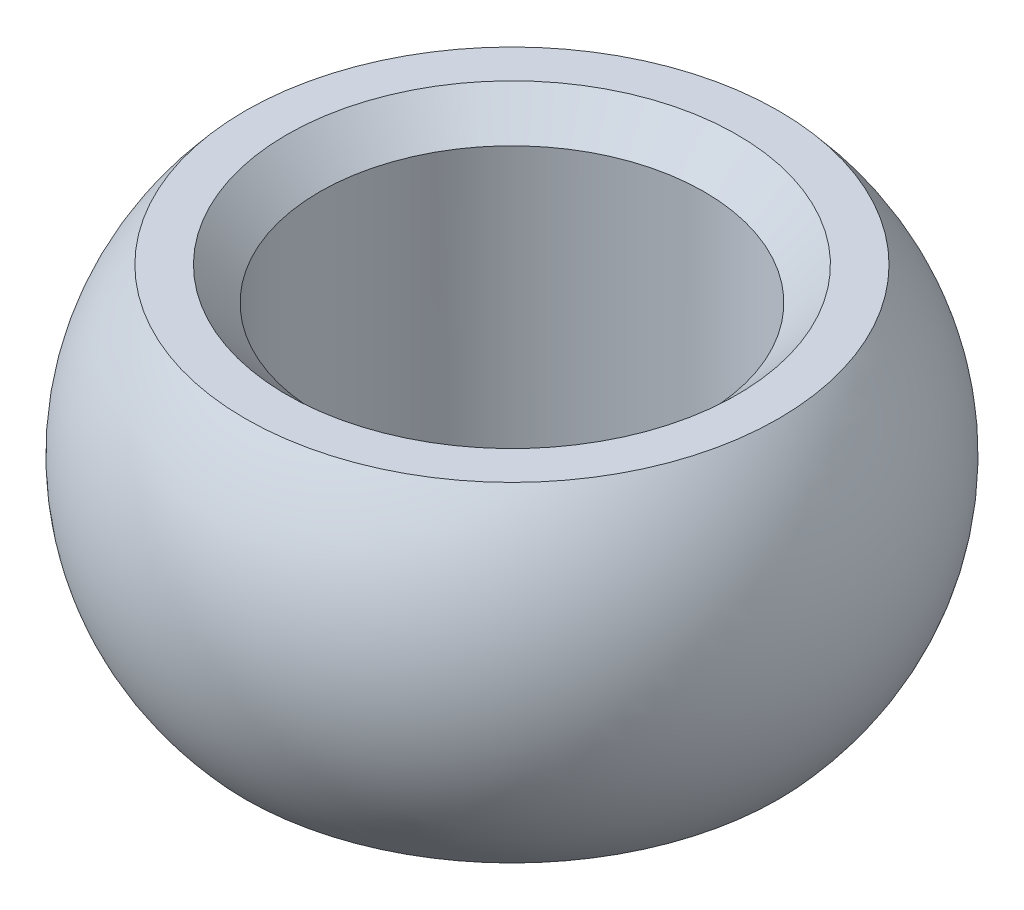
ISO-10303-21;
HEADER;
FILE_DESCRIPTION(('STEP AP214'),'2;1');
FILE_NAME('part.step','',(''),(''),'','','');
FILE_SCHEMA(('AUTOMOTIVE_DESIGN { 1 0 10303 214 1 1 1 1 }'));
ENDSEC;
DATA;
#1=APPLICATION_CONTEXT('core data for automotive mechanical design processes');
#2=APPLICATION_PROTOCOL_DEFINITION('international standard','automotive_design',2000,#1);
#3=PRODUCT_CONTEXT('',#1,'mechanical');
#4=PRODUCT('Part','Part','',(#3));
#5=PRODUCT_RELATED_PRODUCT_CATEGORY('part','',(#4));
#6=PRODUCT_DEFINITION_FORMATION('','',#4);
#7=PRODUCT_DEFINITION_CONTEXT('part definition',#1,'design');
#8=PRODUCT_DEFINITION('design','',#6,#7);
#9=PRODUCT_DEFINITION_SHAPE('','',#8);
#10=(LENGTH_UNIT() NAMED_UNIT(*) SI_UNIT(.MILLI.,.METRE.));
#11=(NAMED_UNIT(*) PLANE_ANGLE_UNIT() SI_UNIT($,.RADIAN.));
#12=(NAMED_UNIT(*) SI_UNIT($,.STERADIAN.) SOLID_ANGLE_UNIT());
#13=UNCERTAINTY_MEASURE_WITH_UNIT(LENGTH_MEASURE(1.E-05),#10,'distance_accuracy_value','');
#14=(GEOMETRIC_REPRESENTATION_CONTEXT(3) GLOBAL_UNCERTAINTY_ASSIGNED_CONTEXT((#13)) GLOBAL_UNIT_ASSIGNED_CONTEXT((#10,
#11,#12)) REPRESENTATION_CONTEXT('',''));
#15=CARTESIAN_POINT('',(0.,0.,0.));
#16=DIRECTION('',(0.,0.,1.));
#17=DIRECTION('',(1.,0.,0.));
#18=AXIS2_PLACEMENT_3D('',#15,#16,#17);
#19=CARTESIAN_POINT('',(1.51347731112162E-12,-441.214999731284,0.));
#20=DIRECTION('',(0.,-1.,0.));
#21=DIRECTION('',(1.,0.,0.));
#22=AXIS2_PLACEMENT_3D('',#19,#20,#21);
#23=CYLINDRICAL_SURFACE('',#22,17.5);
#24=CARTESIAN_POINT('',(0.,12.,0.));
#25=DIRECTION('',(0.,1.,0.));
#26=DIRECTION('',(-1.,0.,0.));
#27=AXIS2_PLACEMENT_3D('',#24,#25,#26);
#28=CIRCLE('',#27,17.5);
#29=CARTESIAN_POINT('',(-17.5,11.9999999999999,0.));
#30=VERTEX_POINT('',#29);
#31=EDGE_CURVE('E41',#30,#30,#28,.T.);
#32=ORIENTED_EDGE('',*,*,#31,.T.);
#33=EDGE_LOOP('',(#32));
#34=FACE_BOUND('',#33,.T.);
#35=CARTESIAN_POINT('',(0.,-12.0000000000001,0.));
#36=DIRECTION('',(0.,-1.,0.));
#37=DIRECTION('',(1.,0.,0.));
#38=AXIS2_PLACEMENT_3D('',#35,#36,#37);
#39=CIRCLE('',#38,17.5);
#40=CARTESIAN_POINT('',(17.5,-12.,0.));
#41=VERTEX_POINT('',#40);
#42=EDGE_CURVE('E45',#41,#41,#39,.T.);
#43=ORIENTED_EDGE('',*,*,#42,.T.);
#44=EDGE_LOOP('',(#43));
#45=FACE_BOUND('',#44,.T.);
#46=ADVANCED_FACE('F33',(#34,#45),#23,.F.);
#47=CARTESIAN_POINT('',(17.5,15.,0.));
#48=DIRECTION('',(0.,1.,0.));
#49=DIRECTION('',(-1.,0.,0.));
#50=AXIS2_PLACEMENT_3D('',#47,#48,#49);
#51=PLANE('',#50);
#52=CARTESIAN_POINT('',(0.,14.9999999999999,0.));
#53=DIRECTION('',(0.,1.,0.));
#54=DIRECTION('',(-1.,0.,0.));
#55=AXIS2_PLACEMENT_3D('',#52,#53,#54);
#56=CIRCLE('',#55,20.5);
#57=CARTESIAN_POINT('',(-20.5,14.9999999999999,0.));
#58=VERTEX_POINT('',#57);
#59=EDGE_CURVE('E49',#58,#58,#56,.F.);
#60=ORIENTED_EDGE('',*,*,#59,.T.);
#61=EDGE_LOOP('',(#60));
#62=FACE_BOUND('',#61,.T.);
#63=CARTESIAN_POINT('',(0.,15.,0.));
#64=DIRECTION('',(0.,-1.,0.));
#65=DIRECTION('',(1.,0.,0.));
#66=AXIS2_PLACEMENT_3D('',#63,#64,#65);
#67=CIRCLE('',#66,24.2705098312485);
#68=CARTESIAN_POINT('',(24.2705098312484,15.,0.));
#69=VERTEX_POINT('',#68);
#70=EDGE_CURVE('E54',#69,#69,#67,.T.);
#71=ORIENTED_EDGE('',*,*,#70,.F.);
#72=EDGE_LOOP('',(#71));
#73=FACE_BOUND('',#72,.T.);
#74=ADVANCED_FACE('F65',(#62,#73),#51,.T.);
#75=CARTESIAN_POINT('',(0.,0.,0.));
#76=DIRECTION('',(0.,-1.,0.));
#77=DIRECTION('',(1.,0.,0.));
#78=AXIS2_PLACEMENT_3D('',#75,#76,#77);
#79=DEGENERATE_TOROIDAL_SURFACE('',#78,7.5,22.5,.T.);
#80=ORIENTED_EDGE('',*,*,#70,.T.);
#81=EDGE_LOOP('',(#80));
#82=FACE_BOUND('',#81,.T.);
#83=CARTESIAN_POINT('',(0.,-15.0000000000001,0.));
#84=DIRECTION('',(0.,-1.,0.));
#85=DIRECTION('',(1.,0.,0.));
#86=AXIS2_PLACEMENT_3D('',#83,#84,#85);
#87=CIRCLE('',#86,24.2705098312484);
#88=CARTESIAN_POINT('',(24.2705098312484,-15.,0.));
#89=VERTEX_POINT('',#88);
#90=EDGE_CURVE('E57',#89,#89,#87,.T.);
#91=ORIENTED_EDGE('',*,*,#90,.F.);
#92=EDGE_LOOP('',(#91));
#93=FACE_BOUND('',#92,.T.);
#94=ADVANCED_FACE('F63',(#82,#93),#79,.T.);
#95=CARTESIAN_POINT('',(17.5,-15.,0.));
#96=DIRECTION('',(0.,-1.,0.));
#97=DIRECTION('',(1.,0.,0.));
#98=AXIS2_PLACEMENT_3D('',#95,#96,#97);
#99=PLANE('',#98);
#100=CARTESIAN_POINT('',(0.,-15.0000000000001,0.));
#101=DIRECTION('',(0.,-1.,0.));
#102=DIRECTION('',(1.,0.,0.));
#103=AXIS2_PLACEMENT_3D('',#100,#101,#102);
#104=CIRCLE('',#103,20.5000000000001);
#105=CARTESIAN_POINT('',(20.5000000000001,-15.,0.));
#106=VERTEX_POINT('',#105);
#107=EDGE_CURVE('E10',#106,#106,#104,.F.);
#108=ORIENTED_EDGE('',*,*,#107,.T.);
#109=EDGE_LOOP('',(#108));
#110=FACE_BOUND('',#109,.T.);
#111=ORIENTED_EDGE('',*,*,#90,.T.);
#112=EDGE_LOOP('',(#111));
#113=FACE_BOUND('',#112,.T.);
#114=ADVANCED_FACE('F61',(#110,#113),#99,.T.);
#115=CARTESIAN_POINT('',(0.,15.,0.));
#116=DIRECTION('',(0.,1.,0.));
#117=DIRECTION('',(-1.,0.,0.));
#118=AXIS2_PLACEMENT_3D('',#115,#116,#117);
#119=CONICAL_SURFACE('',#118,20.5,0.785398163397446);
#120=ORIENTED_EDGE('',*,*,#31,.F.);
#121=EDGE_LOOP('',(#120));
#122=FACE_BOUND('',#121,.T.);
#123=ORIENTED_EDGE('',*,*,#59,.F.);
#124=EDGE_LOOP('',(#123));
#125=FACE_BOUND('',#124,.T.);
#126=ADVANCED_FACE('F72',(#122,#125),#119,.F.);
#127=CARTESIAN_POINT('',(0.,-12.0000000000001,0.));
#128=DIRECTION('',(0.,-1.,0.));
#129=DIRECTION('',(1.,0.,0.));
#130=AXIS2_PLACEMENT_3D('',#127,#128,#129);
#131=CONICAL_SURFACE('',#130,17.5,0.785398163397457);
#132=ORIENTED_EDGE('',*,*,#107,.F.);
#133=EDGE_LOOP('',(#132));
#134=FACE_BOUND('',#133,.T.);
#135=ORIENTED_EDGE('',*,*,#42,.F.);
#136=EDGE_LOOP('',(#135));
#137=FACE_BOUND('',#136,.T.);
#138=ADVANCED_FACE('F36',(#134,#137),#131,.F.);
#139=CLOSED_SHELL('',(#46,#74,#94,#114,#126,#138));
#140=MANIFOLD_SOLID_BREP('B2',#139);
#141=ADVANCED_BREP_SHAPE_REPRESENTATION('',(#18,#140),#14);
#142=SHAPE_DEFINITION_REPRESENTATION(#9,#141);
ENDSEC;
END-ISO-10303-21;
